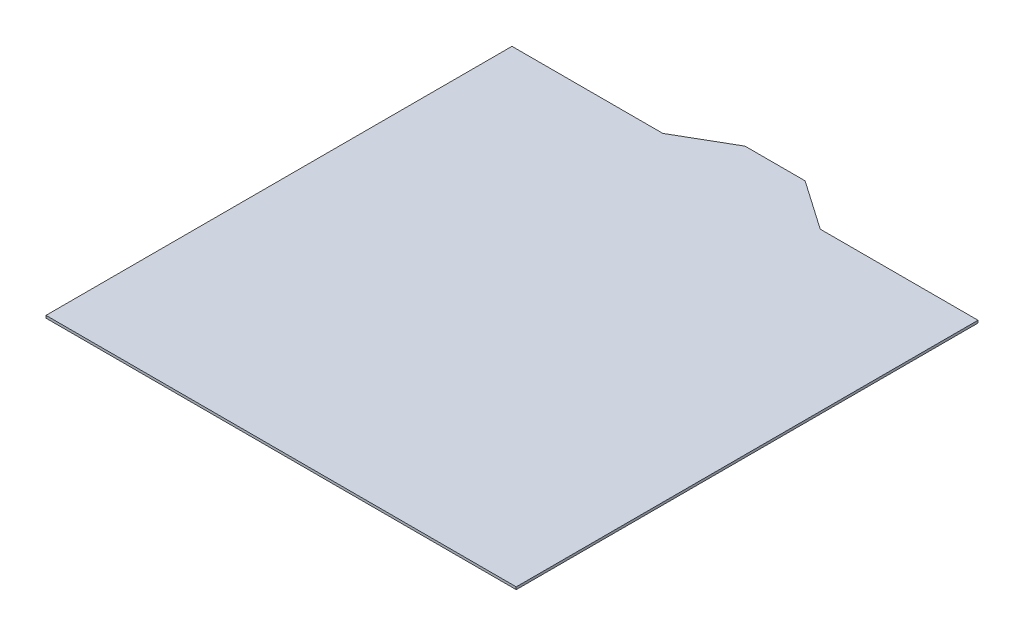
ISO-10303-21;
HEADER;
FILE_DESCRIPTION(('STEP AP214'),'2;1');
FILE_NAME('part.step','',(''),(''),'','','');
FILE_SCHEMA(('AUTOMOTIVE_DESIGN { 1 0 10303 214 1 1 1 1 }'));
ENDSEC;
DATA;
#1=APPLICATION_CONTEXT('core data for automotive mechanical design processes');
#2=APPLICATION_PROTOCOL_DEFINITION('international standard','automotive_design',2000,#1);
#3=PRODUCT_CONTEXT('',#1,'mechanical');
#4=PRODUCT('Part','Part','',(#3));
#5=PRODUCT_RELATED_PRODUCT_CATEGORY('part','',(#4));
#6=PRODUCT_DEFINITION_FORMATION('','',#4);
#7=PRODUCT_DEFINITION_CONTEXT('part definition',#1,'design');
#8=PRODUCT_DEFINITION('design','',#6,#7);
#9=PRODUCT_DEFINITION_SHAPE('','',#8);
#10=(LENGTH_UNIT() NAMED_UNIT(*) SI_UNIT(.MILLI.,.METRE.));
#11=(NAMED_UNIT(*) PLANE_ANGLE_UNIT() SI_UNIT($,.RADIAN.));
#12=(NAMED_UNIT(*) SI_UNIT($,.STERADIAN.) SOLID_ANGLE_UNIT());
#13=UNCERTAINTY_MEASURE_WITH_UNIT(LENGTH_MEASURE(1.E-05),#10,'distance_accuracy_value','');
#14=(GEOMETRIC_REPRESENTATION_CONTEXT(3) GLOBAL_UNCERTAINTY_ASSIGNED_CONTEXT((#13)) GLOBAL_UNIT_ASSIGNED_CONTEXT((#10,
#11,#12)) REPRESENTATION_CONTEXT('',''));
#15=CARTESIAN_POINT('',(0.,0.,0.));
#16=DIRECTION('',(0.,0.,1.));
#17=DIRECTION('',(1.,0.,0.));
#18=AXIS2_PLACEMENT_3D('',#15,#16,#17);
#19=CARTESIAN_POINT('',(50.7310318065677,1.65,-152.895166006041));
#20=DIRECTION('',(0.,0.,1.));
#21=DIRECTION('',(1.,0.,0.));
#22=AXIS2_PLACEMENT_3D('',#19,#20,#21);
#23=PLANE('',#22);
#24=DIRECTION('',(-1.,0.,0.));
#25=VECTOR('',#24,1.);
#26=CARTESIAN_POINT('',(50.7310318065677,0.,-152.895166006041));
#27=LINE('',#26,#25);
#28=CARTESIAN_POINT('',(155.702677975804,0.,-152.895166006041));
#29=VERTEX_POINT('',#28);
#30=CARTESIAN_POINT('',(50.7310318065677,0.,-152.895166006041));
#31=VERTEX_POINT('',#30);
#32=EDGE_CURVE('E139',#29,#31,#27,.T.);
#33=ORIENTED_EDGE('',*,*,#32,.T.);
#34=DIRECTION('',(0.,-1.,0.));
#35=VECTOR('',#34,1.);
#36=CARTESIAN_POINT('',(50.7310318065677,1.65,-152.895166006041));
#37=LINE('',#36,#35);
#38=CARTESIAN_POINT('',(50.7310318065677,1.65,-152.895166006041));
#39=VERTEX_POINT('',#38);
#40=EDGE_CURVE('E11',#39,#31,#37,.T.);
#41=ORIENTED_EDGE('',*,*,#40,.F.);
#42=DIRECTION('',(-1.,0.,0.));
#43=VECTOR('',#42,1.);
#44=CARTESIAN_POINT('',(50.7310318065677,1.65,-152.895166006041));
#45=LINE('',#44,#43);
#46=CARTESIAN_POINT('',(155.702677975804,1.65,-152.895166006041));
#47=VERTEX_POINT('',#46);
#48=EDGE_CURVE('E153',#47,#39,#45,.T.);
#49=ORIENTED_EDGE('',*,*,#48,.F.);
#50=DIRECTION('',(0.,-1.,0.));
#51=VECTOR('',#50,1.);
#52=CARTESIAN_POINT('',(155.702677975804,1.65,-152.895166006041));
#53=LINE('',#52,#51);
#54=EDGE_CURVE('E135',#47,#29,#53,.T.);
#55=ORIENTED_EDGE('',*,*,#54,.T.);
#56=EDGE_LOOP('',(#33,#41,#49,#55));
#57=FACE_BOUND('',#56,.T.);
#58=ADVANCED_FACE('F43',(#57),#23,.F.);
#59=CARTESIAN_POINT('',(17.8726779758039,1.65,-175.705878040791));
#60=DIRECTION('',(-0.570267800868773,0.,0.821458845769095));
#61=DIRECTION('',(0.821458845769094,0.,0.570267800868773));
#62=AXIS2_PLACEMENT_3D('',#59,#60,#61);
#63=PLANE('',#62);
#64=DIRECTION('',(-0.821458845769095,0.,-0.570267800868773));
#65=VECTOR('',#64,1.);
#66=CARTESIAN_POINT('',(17.8726779758039,0.,-175.705878040791));
#67=LINE('',#66,#65);
#68=CARTESIAN_POINT('',(17.8726779758039,0.,-175.705878040791));
#69=VERTEX_POINT('',#68);
#70=EDGE_CURVE('E142',#31,#69,#67,.T.);
#71=ORIENTED_EDGE('',*,*,#70,.T.);
#72=DIRECTION('',(0.,-1.,0.));
#73=VECTOR('',#72,1.);
#74=CARTESIAN_POINT('',(17.8726779758039,1.65,-175.705878040791));
#75=LINE('',#74,#73);
#76=CARTESIAN_POINT('',(17.8726779758039,1.65,-175.705878040791));
#77=VERTEX_POINT('',#76);
#78=EDGE_CURVE('E51',#77,#69,#75,.T.);
#79=ORIENTED_EDGE('',*,*,#78,.F.);
#80=DIRECTION('',(-0.821458845769095,0.,-0.570267800868773));
#81=VECTOR('',#80,1.);
#82=CARTESIAN_POINT('',(17.8726779758039,1.65,-175.705878040791));
#83=LINE('',#82,#81);
#84=EDGE_CURVE('E102',#39,#77,#83,.T.);
#85=ORIENTED_EDGE('',*,*,#84,.F.);
#86=ORIENTED_EDGE('',*,*,#40,.T.);
#87=EDGE_LOOP('',(#71,#79,#85,#86));
#88=FACE_BOUND('',#87,.T.);
#89=ADVANCED_FACE('F188',(#88),#63,.F.);
#90=CARTESIAN_POINT('',(-22.1273220241961,1.65,-175.705878040791));
#91=DIRECTION('',(0.,0.,1.));
#92=DIRECTION('',(1.,0.,0.));
#93=AXIS2_PLACEMENT_3D('',#90,#91,#92);
#94=PLANE('',#93);
#95=DIRECTION('',(-1.,0.,0.));
#96=VECTOR('',#95,1.);
#97=CARTESIAN_POINT('',(-22.1273220241961,0.,-175.705878040791));
#98=LINE('',#97,#96);
#99=CARTESIAN_POINT('',(-22.1273220241961,0.,-175.705878040791));
#100=VERTEX_POINT('',#99);
#101=EDGE_CURVE('E144',#69,#100,#98,.T.);
#102=ORIENTED_EDGE('',*,*,#101,.T.);
#103=DIRECTION('',(0.,-1.,0.));
#104=VECTOR('',#103,1.);
#105=CARTESIAN_POINT('',(-22.1273220241961,1.65,-175.705878040791));
#106=LINE('',#105,#104);
#107=CARTESIAN_POINT('',(-22.1273220241961,1.65,-175.705878040791));
#108=VERTEX_POINT('',#107);
#109=EDGE_CURVE('E160',#108,#100,#106,.T.);
#110=ORIENTED_EDGE('',*,*,#109,.F.);
#111=DIRECTION('',(-1.,0.,0.));
#112=VECTOR('',#111,1.);
#113=CARTESIAN_POINT('',(-22.1273220241961,1.65,-175.705878040791));
#114=LINE('',#113,#112);
#115=EDGE_CURVE('E168',#77,#108,#114,.T.);
#116=ORIENTED_EDGE('',*,*,#115,.F.);
#117=ORIENTED_EDGE('',*,*,#78,.T.);
#118=EDGE_LOOP('',(#102,#110,#116,#117));
#119=FACE_BOUND('',#118,.T.);
#120=ADVANCED_FACE('F166',(#119),#94,.F.);
#121=CARTESIAN_POINT('',(-22.1273220241961,1.65,-175.705878040791));
#122=DIRECTION('',(0.5,0.,0.866025403784439));
#123=DIRECTION('',(0.866025403784439,0.,-0.5));
#124=AXIS2_PLACEMENT_3D('',#121,#122,#123);
#125=PLANE('',#124);
#126=DIRECTION('',(-0.866025403784439,0.,0.5));
#127=VECTOR('',#126,1.);
#128=CARTESIAN_POINT('',(-22.1273220241961,0.,-175.705878040791));
#129=LINE('',#128,#127);
#130=CARTESIAN_POINT('',(-56.7683381755736,0.,-155.705878040791));
#131=VERTEX_POINT('',#130);
#132=EDGE_CURVE('E146',#100,#131,#129,.T.);
#133=ORIENTED_EDGE('',*,*,#132,.T.);
#134=DIRECTION('',(0.,-1.,0.));
#135=VECTOR('',#134,1.);
#136=CARTESIAN_POINT('',(-56.7683381755736,1.65,-155.705878040791));
#137=LINE('',#136,#135);
#138=CARTESIAN_POINT('',(-56.7683381755736,1.65,-155.705878040791));
#139=VERTEX_POINT('',#138);
#140=EDGE_CURVE('E157',#139,#131,#137,.T.);
#141=ORIENTED_EDGE('',*,*,#140,.F.);
#142=DIRECTION('',(-0.866025403784439,0.,0.5));
#143=VECTOR('',#142,1.);
#144=CARTESIAN_POINT('',(-22.1273220241961,1.65,-175.705878040791));
#145=LINE('',#144,#143);
#146=EDGE_CURVE('E180',#108,#139,#145,.T.);
#147=ORIENTED_EDGE('',*,*,#146,.F.);
#148=ORIENTED_EDGE('',*,*,#109,.T.);
#149=EDGE_LOOP('',(#133,#141,#147,#148));
#150=FACE_BOUND('',#149,.T.);
#151=ADVANCED_FACE('F176',(#150),#125,.F.);
#152=CARTESIAN_POINT('',(-157.127322024196,1.65,-155.705878040791));
#153=DIRECTION('',(0.,0.,1.));
#154=DIRECTION('',(1.,0.,0.));
#155=AXIS2_PLACEMENT_3D('',#152,#153,#154);
#156=PLANE('',#155);
#157=DIRECTION('',(-1.,0.,0.));
#158=VECTOR('',#157,1.);
#159=CARTESIAN_POINT('',(-157.127322024196,0.,-155.705878040791));
#160=LINE('',#159,#158);
#161=CARTESIAN_POINT('',(-157.127322024196,0.,-155.705878040791));
#162=VERTEX_POINT('',#161);
#163=EDGE_CURVE('E148',#131,#162,#160,.T.);
#164=ORIENTED_EDGE('',*,*,#163,.T.);
#165=DIRECTION('',(0.,-1.,0.));
#166=VECTOR('',#165,1.);
#167=CARTESIAN_POINT('',(-157.127322024196,1.65,-155.705878040791));
#168=LINE('',#167,#166);
#169=CARTESIAN_POINT('',(-157.127322024196,1.65,-155.705878040791));
#170=VERTEX_POINT('',#169);
#171=EDGE_CURVE('E130',#170,#162,#168,.T.);
#172=ORIENTED_EDGE('',*,*,#171,.F.);
#173=DIRECTION('',(-1.,0.,0.));
#174=VECTOR('',#173,1.);
#175=CARTESIAN_POINT('',(-157.127322024196,1.65,-155.705878040791));
#176=LINE('',#175,#174);
#177=EDGE_CURVE('E121',#139,#170,#176,.T.);
#178=ORIENTED_EDGE('',*,*,#177,.F.);
#179=ORIENTED_EDGE('',*,*,#140,.T.);
#180=EDGE_LOOP('',(#164,#172,#178,#179));
#181=FACE_BOUND('',#180,.T.);
#182=ADVANCED_FACE('F179',(#181),#156,.F.);
#183=CARTESIAN_POINT('',(-157.127322024196,1.65,154.294121959209));
#184=DIRECTION('',(1.,0.,0.));
#185=DIRECTION('',(0.,0.,-1.));
#186=AXIS2_PLACEMENT_3D('',#183,#184,#185);
#187=PLANE('',#186);
#188=DIRECTION('',(0.,0.,1.));
#189=VECTOR('',#188,1.);
#190=CARTESIAN_POINT('',(-157.127322024196,0.,154.294121959209));
#191=LINE('',#190,#189);
#192=CARTESIAN_POINT('',(-157.127322024196,0.,154.294121959209));
#193=VERTEX_POINT('',#192);
#194=EDGE_CURVE('E129',#162,#193,#191,.T.);
#195=ORIENTED_EDGE('',*,*,#194,.T.);
#196=DIRECTION('',(0.,-1.,0.));
#197=VECTOR('',#196,1.);
#198=CARTESIAN_POINT('',(-157.127322024196,1.65,154.294121959209));
#199=LINE('',#198,#197);
#200=CARTESIAN_POINT('',(-157.127322024196,1.65,154.294121959209));
#201=VERTEX_POINT('',#200);
#202=EDGE_CURVE('E126',#201,#193,#199,.T.);
#203=ORIENTED_EDGE('',*,*,#202,.F.);
#204=DIRECTION('',(0.,0.,1.));
#205=VECTOR('',#204,1.);
#206=CARTESIAN_POINT('',(-157.127322024196,1.65,154.294121959209));
#207=LINE('',#206,#205);
#208=EDGE_CURVE('E115',#170,#201,#207,.T.);
#209=ORIENTED_EDGE('',*,*,#208,.F.);
#210=ORIENTED_EDGE('',*,*,#171,.T.);
#211=EDGE_LOOP('',(#195,#203,#209,#210));
#212=FACE_BOUND('',#211,.T.);
#213=ADVANCED_FACE('F127',(#212),#187,.F.);
#214=CARTESIAN_POINT('',(-157.127322024196,1.65,154.294121959209));
#215=DIRECTION('',(0.,0.,-1.));
#216=DIRECTION('',(-1.,0.,0.));
#217=AXIS2_PLACEMENT_3D('',#214,#215,#216);
#218=PLANE('',#217);
#219=DIRECTION('',(1.,0.,0.));
#220=VECTOR('',#219,1.);
#221=CARTESIAN_POINT('',(-157.127322024196,0.,154.294121959209));
#222=LINE('',#221,#220);
#223=CARTESIAN_POINT('',(155.702677975804,0.,154.294121959209));
#224=VERTEX_POINT('',#223);
#225=EDGE_CURVE('E88',#193,#224,#222,.T.);
#226=ORIENTED_EDGE('',*,*,#225,.T.);
#227=DIRECTION('',(0.,-1.,0.));
#228=VECTOR('',#227,1.);
#229=CARTESIAN_POINT('',(155.702677975804,1.65,154.294121959209));
#230=LINE('',#229,#228);
#231=CARTESIAN_POINT('',(155.702677975804,1.65,154.294121959209));
#232=VERTEX_POINT('',#231);
#233=EDGE_CURVE('E131',#232,#224,#230,.T.);
#234=ORIENTED_EDGE('',*,*,#233,.F.);
#235=DIRECTION('',(1.,0.,0.));
#236=VECTOR('',#235,1.);
#237=CARTESIAN_POINT('',(-157.127322024196,1.65,154.294121959209));
#238=LINE('',#237,#236);
#239=EDGE_CURVE('E119',#201,#232,#238,.T.);
#240=ORIENTED_EDGE('',*,*,#239,.F.);
#241=ORIENTED_EDGE('',*,*,#202,.T.);
#242=EDGE_LOOP('',(#226,#234,#240,#241));
#243=FACE_BOUND('',#242,.T.);
#244=ADVANCED_FACE('F133',(#243),#218,.F.);
#245=CARTESIAN_POINT('',(155.702677975804,1.65,154.294121959209));
#246=DIRECTION('',(-1.,0.,0.));
#247=DIRECTION('',(0.,0.,1.));
#248=AXIS2_PLACEMENT_3D('',#245,#246,#247);
#249=PLANE('',#248);
#250=DIRECTION('',(0.,0.,-1.));
#251=VECTOR('',#250,1.);
#252=CARTESIAN_POINT('',(155.702677975804,0.,154.294121959209));
#253=LINE('',#252,#251);
#254=EDGE_CURVE('E94',#224,#29,#253,.T.);
#255=ORIENTED_EDGE('',*,*,#254,.T.);
#256=ORIENTED_EDGE('',*,*,#54,.F.);
#257=DIRECTION('',(0.,0.,-1.));
#258=VECTOR('',#257,1.);
#259=CARTESIAN_POINT('',(155.702677975804,1.65,154.294121959209));
#260=LINE('',#259,#258);
#261=EDGE_CURVE('E59',#232,#47,#260,.T.);
#262=ORIENTED_EDGE('',*,*,#261,.F.);
#263=ORIENTED_EDGE('',*,*,#233,.T.);
#264=EDGE_LOOP('',(#255,#256,#262,#263));
#265=FACE_BOUND('',#264,.T.);
#266=ADVANCED_FACE('F204',(#265),#249,.F.);
#267=CARTESIAN_POINT('',(0.,1.65,0.));
#268=DIRECTION('',(0.,1.,0.));
#269=DIRECTION('',(0.,0.,1.));
#270=AXIS2_PLACEMENT_3D('',#267,#268,#269);
#271=PLANE('',#270);
#272=ORIENTED_EDGE('',*,*,#48,.T.);
#273=ORIENTED_EDGE('',*,*,#84,.T.);
#274=ORIENTED_EDGE('',*,*,#115,.T.);
#275=ORIENTED_EDGE('',*,*,#146,.T.);
#276=ORIENTED_EDGE('',*,*,#177,.T.);
#277=ORIENTED_EDGE('',*,*,#208,.T.);
#278=ORIENTED_EDGE('',*,*,#239,.T.);
#279=ORIENTED_EDGE('',*,*,#261,.T.);
#280=EDGE_LOOP('',(#272,#273,#274,#275,#276,#277,#278,#279));
#281=FACE_BOUND('',#280,.T.);
#282=ADVANCED_FACE('F117',(#281),#271,.T.);
#283=CARTESIAN_POINT('',(0.,0.,0.));
#284=DIRECTION('',(0.,1.,0.));
#285=DIRECTION('',(0.,0.,1.));
#286=AXIS2_PLACEMENT_3D('',#283,#284,#285);
#287=PLANE('',#286);
#288=ORIENTED_EDGE('',*,*,#32,.F.);
#289=ORIENTED_EDGE('',*,*,#254,.F.);
#290=ORIENTED_EDGE('',*,*,#225,.F.);
#291=ORIENTED_EDGE('',*,*,#194,.F.);
#292=ORIENTED_EDGE('',*,*,#163,.F.);
#293=ORIENTED_EDGE('',*,*,#132,.F.);
#294=ORIENTED_EDGE('',*,*,#101,.F.);
#295=ORIENTED_EDGE('',*,*,#70,.F.);
#296=EDGE_LOOP('',(#288,#289,#290,#291,#292,#293,#294,#295));
#297=FACE_BOUND('',#296,.T.);
#298=ADVANCED_FACE('F172',(#297),#287,.F.);
#299=CLOSED_SHELL('',(#58,#89,#120,#151,#182,#213,#244,#266,#282,#298));
#300=MANIFOLD_SOLID_BREP('B2',#299);
#301=ADVANCED_BREP_SHAPE_REPRESENTATION('',(#18,#300),#14);
#302=SHAPE_DEFINITION_REPRESENTATION(#9,#301);
ENDSEC;
END-ISO-10303-21;
